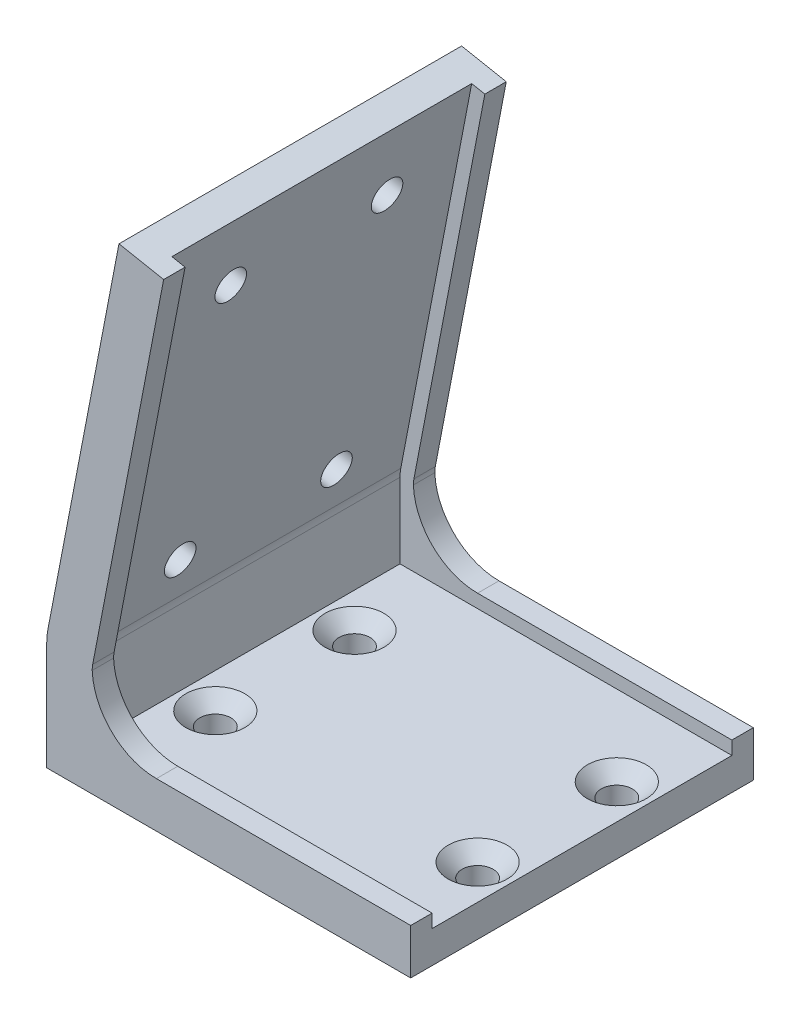
ISO-10303-21;
HEADER;
FILE_DESCRIPTION(('STEP AP214'),'2;1');
FILE_NAME('part.step','',(''),(''),'','','');
FILE_SCHEMA(('AUTOMOTIVE_DESIGN { 1 0 10303 214 1 1 1 1 }'));
ENDSEC;
DATA;
#1=APPLICATION_CONTEXT('core data for automotive mechanical design processes');
#2=APPLICATION_PROTOCOL_DEFINITION('international standard','automotive_design',2000,#1);
#3=PRODUCT_CONTEXT('',#1,'mechanical');
#4=PRODUCT('Part','Part','',(#3));
#5=PRODUCT_RELATED_PRODUCT_CATEGORY('part','',(#4));
#6=PRODUCT_DEFINITION_FORMATION('','',#4);
#7=PRODUCT_DEFINITION_CONTEXT('part definition',#1,'design');
#8=PRODUCT_DEFINITION('design','',#6,#7);
#9=PRODUCT_DEFINITION_SHAPE('','',#8);
#10=(LENGTH_UNIT() NAMED_UNIT(*) SI_UNIT(.MILLI.,.METRE.));
#11=(NAMED_UNIT(*) PLANE_ANGLE_UNIT() SI_UNIT($,.RADIAN.));
#12=(NAMED_UNIT(*) SI_UNIT($,.STERADIAN.) SOLID_ANGLE_UNIT());
#13=UNCERTAINTY_MEASURE_WITH_UNIT(LENGTH_MEASURE(1.E-05),#10,'distance_accuracy_value','');
#14=(GEOMETRIC_REPRESENTATION_CONTEXT(3) GLOBAL_UNCERTAINTY_ASSIGNED_CONTEXT((#13)) GLOBAL_UNIT_ASSIGNED_CONTEXT((#10,
#11,#12)) REPRESENTATION_CONTEXT('',''));
#15=CARTESIAN_POINT('',(0.,0.,0.));
#16=DIRECTION('',(0.,0.,1.));
#17=DIRECTION('',(1.,0.,0.));
#18=AXIS2_PLACEMENT_3D('',#15,#16,#17);
#19=CARTESIAN_POINT('',(-19.865724044626,3.82142894715047,14.));
#20=DIRECTION('',(0.981996385637288,-0.188899705122331,0.));
#21=DIRECTION('',(0.188899705122331,0.981996385637288,0.));
#22=AXIS2_PLACEMENT_3D('',#19,#20,#21);
#23=PLANE('',#22);
#24=CARTESIAN_POINT('',(-12.9558745481218,39.7423279579274,-7.30000000000002));
#25=DIRECTION('',(-0.981996385637288,0.188899705122331,0.));
#26=DIRECTION('',(-0.188899705122331,-0.981996385637288,0.));
#27=AXIS2_PLACEMENT_3D('',#24,#25,#26);
#28=CIRCLE('',#27,1.44999999999999);
#29=CARTESIAN_POINT('',(-13.2297791205491,38.3184331987534,-7.30000000000002));
#30=VERTEX_POINT('',#29);
#31=EDGE_CURVE('E392',#30,#30,#28,.T.);
#32=ORIENTED_EDGE('',*,*,#31,.F.);
#33=EDGE_LOOP('',(#32));
#34=FACE_BOUND('',#33,.T.);
#35=CARTESIAN_POINT('',(-12.9558745481218,39.7423279579274,7.30000000000002));
#36=DIRECTION('',(-0.981996385637288,0.188899705122331,0.));
#37=DIRECTION('',(-0.188899705122331,-0.981996385637288,0.));
#38=AXIS2_PLACEMENT_3D('',#35,#36,#37);
#39=CIRCLE('',#38,1.44999999999999);
#40=CARTESIAN_POINT('',(-13.2297791205491,38.3184331987534,7.30000000000002));
#41=VERTEX_POINT('',#40);
#42=EDGE_CURVE('E637',#41,#41,#39,.T.);
#43=ORIENTED_EDGE('',*,*,#42,.F.);
#44=EDGE_LOOP('',(#43));
#45=FACE_BOUND('',#44,.T.);
#46=CARTESIAN_POINT('',(-17.67836717618,15.1924183169953,-7.30000000000002));
#47=DIRECTION('',(-0.981996385637288,0.188899705122331,0.));
#48=DIRECTION('',(-0.188899705122331,-0.981996385637288,0.));
#49=AXIS2_PLACEMENT_3D('',#46,#47,#48);
#50=CIRCLE('',#49,1.44999999999999);
#51=CARTESIAN_POINT('',(-17.9522717486074,13.7685235578212,-7.30000000000002));
#52=VERTEX_POINT('',#51);
#53=EDGE_CURVE('E645',#52,#52,#50,.T.);
#54=ORIENTED_EDGE('',*,*,#53,.F.);
#55=EDGE_LOOP('',(#54));
#56=FACE_BOUND('',#55,.T.);
#57=CARTESIAN_POINT('',(-17.67836717618,15.1924183169953,7.30000000000002));
#58=DIRECTION('',(-0.981996385637288,0.188899705122331,0.));
#59=DIRECTION('',(-0.188899705122331,-0.981996385637288,0.));
#60=AXIS2_PLACEMENT_3D('',#57,#58,#59);
#61=CIRCLE('',#60,1.44999999999999);
#62=CARTESIAN_POINT('',(-17.9522717486074,13.7685235578212,7.30000000000002));
#63=VERTEX_POINT('',#62);
#64=EDGE_CURVE('E653',#63,#63,#61,.T.);
#65=ORIENTED_EDGE('',*,*,#64,.F.);
#66=EDGE_LOOP('',(#65));
#67=FACE_BOUND('',#66,.T.);
#68=DIRECTION('',(0.,0.,-1.));
#69=VECTOR('',#68,1.);
#70=CARTESIAN_POINT('',(-11.7494191021825,46.0140946956126,14.));
#71=LINE('',#70,#69);
#72=CARTESIAN_POINT('',(-11.7494191021825,46.0140946956126,16.));
#73=VERTEX_POINT('',#72);
#74=CARTESIAN_POINT('',(-11.7494191021825,46.0140946956126,-16.));
#75=VERTEX_POINT('',#74);
#76=EDGE_CURVE('E358',#73,#75,#71,.T.);
#77=ORIENTED_EDGE('',*,*,#76,.T.);
#78=DIRECTION('',(-0.188899705122331,-0.981996385637288,0.));
#79=VECTOR('',#78,1.);
#80=CARTESIAN_POINT('',(-19.865724044626,3.82142894715047,-16.));
#81=LINE('',#80,#79);
#82=CARTESIAN_POINT('',(-18.373974699461,11.5762979358563,-16.));
#83=VERTEX_POINT('',#82);
#84=EDGE_CURVE('E224',#75,#83,#81,.T.);
#85=ORIENTED_EDGE('',*,*,#84,.T.);
#86=DIRECTION('',(0.,0.,-1.));
#87=VECTOR('',#86,1.);
#88=CARTESIAN_POINT('',(-18.373974699461,11.5762979358563,14.));
#89=LINE('',#88,#87);
#90=CARTESIAN_POINT('',(-18.373974699461,11.5762979358563,16.));
#91=VERTEX_POINT('',#90);
#92=EDGE_CURVE('E384',#91,#83,#89,.T.);
#93=ORIENTED_EDGE('',*,*,#92,.F.);
#94=DIRECTION('',(0.188899705122331,0.981996385637288,0.));
#95=VECTOR('',#94,1.);
#96=CARTESIAN_POINT('',(-19.865724044626,3.82142894715047,16.));
#97=LINE('',#96,#95);
#98=EDGE_CURVE('E286',#91,#73,#97,.T.);
#99=ORIENTED_EDGE('',*,*,#98,.T.);
#100=EDGE_LOOP('',(#77,#85,#93,#99));
#101=FACE_BOUND('',#100,.T.);
#102=ADVANCED_FACE('F41',(#34,#45,#56,#67,#101),#23,.F.);
#103=CARTESIAN_POINT('',(-11.5,10.254,14.));
#104=DIRECTION('',(0.,0.,-1.));
#105=DIRECTION('',(-1.,0.,0.));
#106=AXIS2_PLACEMENT_3D('',#103,#104,#105);
#107=CYLINDRICAL_SURFACE('',#106,7.);
#108=ORIENTED_EDGE('',*,*,#92,.T.);
#109=CARTESIAN_POINT('',(-11.5,10.254,-16.));
#110=DIRECTION('',(0.,0.,1.));
#111=DIRECTION('',(1.,0.,0.));
#112=AXIS2_PLACEMENT_3D('',#109,#110,#111);
#113=CIRCLE('',#112,7.);
#114=CARTESIAN_POINT('',(-18.5,10.254,-16.));
#115=VERTEX_POINT('',#114);
#116=EDGE_CURVE('E220',#83,#115,#113,.T.);
#117=ORIENTED_EDGE('',*,*,#116,.T.);
#118=DIRECTION('',(0.,0.,-1.));
#119=VECTOR('',#118,1.);
#120=CARTESIAN_POINT('',(-18.5,10.254,14.));
#121=LINE('',#120,#119);
#122=CARTESIAN_POINT('',(-18.5,10.254,16.));
#123=VERTEX_POINT('',#122);
#124=EDGE_CURVE('E381',#123,#115,#121,.T.);
#125=ORIENTED_EDGE('',*,*,#124,.F.);
#126=CARTESIAN_POINT('',(-11.5,10.254,16.));
#127=DIRECTION('',(0.,0.,1.));
#128=DIRECTION('',(1.,0.,0.));
#129=AXIS2_PLACEMENT_3D('',#126,#127,#128);
#130=CIRCLE('',#129,7.);
#131=EDGE_CURVE('E282',#91,#123,#130,.T.);
#132=ORIENTED_EDGE('',*,*,#131,.F.);
#133=EDGE_LOOP('',(#108,#117,#125,#132));
#134=FACE_BOUND('',#133,.T.);
#135=ADVANCED_FACE('F445',(#134),#107,.T.);
#136=CARTESIAN_POINT('',(-18.5,0.,14.));
#137=DIRECTION('',(1.,0.,0.));
#138=DIRECTION('',(0.,0.,-1.));
#139=AXIS2_PLACEMENT_3D('',#136,#137,#138);
#140=PLANE('',#139);
#141=ORIENTED_EDGE('',*,*,#124,.T.);
#142=DIRECTION('',(0.,-1.,0.));
#143=VECTOR('',#142,1.);
#144=CARTESIAN_POINT('',(-18.5,0.,-16.));
#145=LINE('',#144,#143);
#146=CARTESIAN_POINT('',(-18.5,0.250000000000004,-16.));
#147=VERTEX_POINT('',#146);
#148=EDGE_CURVE('E213',#115,#147,#145,.T.);
#149=ORIENTED_EDGE('',*,*,#148,.T.);
#150=DIRECTION('',(0.,0.,-1.));
#151=VECTOR('',#150,1.);
#152=CARTESIAN_POINT('',(-18.5,0.250000000000003,14.));
#153=LINE('',#152,#151);
#154=CARTESIAN_POINT('',(-18.5,0.250000000000003,16.));
#155=VERTEX_POINT('',#154);
#156=EDGE_CURVE('E378',#155,#147,#153,.T.);
#157=ORIENTED_EDGE('',*,*,#156,.F.);
#158=DIRECTION('',(0.,1.,0.));
#159=VECTOR('',#158,1.);
#160=CARTESIAN_POINT('',(-18.5,0.,16.));
#161=LINE('',#160,#159);
#162=EDGE_CURVE('E278',#155,#123,#161,.T.);
#163=ORIENTED_EDGE('',*,*,#162,.T.);
#164=EDGE_LOOP('',(#141,#149,#157,#163));
#165=FACE_BOUND('',#164,.T.);
#166=ADVANCED_FACE('F450',(#165),#140,.F.);
#167=CARTESIAN_POINT('',(0.,0.250000000000003,14.));
#168=DIRECTION('',(0.,1.,0.));
#169=DIRECTION('',(0.,0.,1.));
#170=AXIS2_PLACEMENT_3D('',#167,#168,#169);
#171=PLANE('',#170);
#172=CARTESIAN_POINT('',(-12.25,0.250000000000003,-6.5));
#173=DIRECTION('',(0.,1.,0.));
#174=DIRECTION('',(0.,0.,1.));
#175=AXIS2_PLACEMENT_3D('',#172,#173,#174);
#176=CIRCLE('',#175,1.45);
#177=CARTESIAN_POINT('',(-12.25,0.250000000000003,-5.05));
#178=VERTEX_POINT('',#177);
#179=EDGE_CURVE('E406',#178,#178,#176,.T.);
#180=ORIENTED_EDGE('',*,*,#179,.T.);
#181=EDGE_LOOP('',(#180));
#182=FACE_BOUND('',#181,.T.);
#183=CARTESIAN_POINT('',(12.25,0.250000000000003,-6.5));
#184=DIRECTION('',(0.,1.,0.));
#185=DIRECTION('',(0.,0.,1.));
#186=AXIS2_PLACEMENT_3D('',#183,#184,#185);
#187=CIRCLE('',#186,1.45);
#188=CARTESIAN_POINT('',(12.25,0.250000000000003,-5.05));
#189=VERTEX_POINT('',#188);
#190=EDGE_CURVE('E400',#189,#189,#187,.T.);
#191=ORIENTED_EDGE('',*,*,#190,.T.);
#192=EDGE_LOOP('',(#191));
#193=FACE_BOUND('',#192,.T.);
#194=CARTESIAN_POINT('',(12.25,0.250000000000003,6.5));
#195=DIRECTION('',(0.,1.,0.));
#196=DIRECTION('',(0.,0.,1.));
#197=AXIS2_PLACEMENT_3D('',#194,#195,#196);
#198=CIRCLE('',#197,1.45);
#199=CARTESIAN_POINT('',(12.25,0.250000000000003,7.95));
#200=VERTEX_POINT('',#199);
#201=EDGE_CURVE('E394',#200,#200,#198,.T.);
#202=ORIENTED_EDGE('',*,*,#201,.T.);
#203=EDGE_LOOP('',(#202));
#204=FACE_BOUND('',#203,.T.);
#205=CARTESIAN_POINT('',(-12.25,0.250000000000003,6.5));
#206=DIRECTION('',(0.,1.,0.));
#207=DIRECTION('',(0.,0.,1.));
#208=AXIS2_PLACEMENT_3D('',#205,#206,#207);
#209=CIRCLE('',#208,1.45);
#210=CARTESIAN_POINT('',(-12.25,0.250000000000003,7.95));
#211=VERTEX_POINT('',#210);
#212=EDGE_CURVE('E388',#211,#211,#209,.T.);
#213=ORIENTED_EDGE('',*,*,#212,.T.);
#214=EDGE_LOOP('',(#213));
#215=FACE_BOUND('',#214,.T.);
#216=ORIENTED_EDGE('',*,*,#156,.T.);
#217=DIRECTION('',(1.,0.,0.));
#218=VECTOR('',#217,1.);
#219=CARTESIAN_POINT('',(0.,0.250000000000003,-16.));
#220=LINE('',#219,#218);
#221=CARTESIAN_POINT('',(15.5,0.250000000000003,-16.));
#222=VERTEX_POINT('',#221);
#223=EDGE_CURVE('E210',#147,#222,#220,.T.);
#224=ORIENTED_EDGE('',*,*,#223,.T.);
#225=DIRECTION('',(0.,0.,-1.));
#226=VECTOR('',#225,1.);
#227=CARTESIAN_POINT('',(15.5,0.250000000000003,14.));
#228=LINE('',#227,#226);
#229=CARTESIAN_POINT('',(15.5,0.250000000000003,16.));
#230=VERTEX_POINT('',#229);
#231=EDGE_CURVE('E208',#230,#222,#228,.T.);
#232=ORIENTED_EDGE('',*,*,#231,.F.);
#233=DIRECTION('',(-1.,0.,0.));
#234=VECTOR('',#233,1.);
#235=CARTESIAN_POINT('',(0.,0.250000000000003,16.));
#236=LINE('',#235,#234);
#237=EDGE_CURVE('E274',#230,#155,#236,.T.);
#238=ORIENTED_EDGE('',*,*,#237,.T.);
#239=EDGE_LOOP('',(#216,#224,#232,#238));
#240=FACE_BOUND('',#239,.T.);
#241=ADVANCED_FACE('F458',(#182,#193,#204,#215,#240),#171,.F.);
#242=CARTESIAN_POINT('',(15.5,0.,14.));
#243=DIRECTION('',(1.,0.,0.));
#244=DIRECTION('',(0.,0.,-1.));
#245=AXIS2_PLACEMENT_3D('',#242,#243,#244);
#246=PLANE('',#245);
#247=ORIENTED_EDGE('',*,*,#231,.T.);
#248=DIRECTION('',(0.,-1.,0.));
#249=VECTOR('',#248,1.);
#250=CARTESIAN_POINT('',(15.5,0.,-16.));
#251=LINE('',#250,#249);
#252=CARTESIAN_POINT('',(15.5,4.5,-16.));
#253=VERTEX_POINT('',#252);
#254=EDGE_CURVE('E184',#253,#222,#251,.T.);
#255=ORIENTED_EDGE('',*,*,#254,.F.);
#256=DIRECTION('',(0.,0.,1.));
#257=VECTOR('',#256,1.);
#258=CARTESIAN_POINT('',(15.5,4.5,-16.));
#259=LINE('',#258,#257);
#260=CARTESIAN_POINT('',(15.5,4.5,-14.));
#261=VERTEX_POINT('',#260);
#262=EDGE_CURVE('E195',#253,#261,#259,.T.);
#263=ORIENTED_EDGE('',*,*,#262,.T.);
#264=DIRECTION('',(0.,-1.,0.));
#265=VECTOR('',#264,1.);
#266=CARTESIAN_POINT('',(15.5,0.,-14.));
#267=LINE('',#266,#265);
#268=CARTESIAN_POINT('',(15.5,3.25,-14.));
#269=VERTEX_POINT('',#268);
#270=EDGE_CURVE('E240',#261,#269,#267,.T.);
#271=ORIENTED_EDGE('',*,*,#270,.T.);
#272=DIRECTION('',(0.,0.,-1.));
#273=VECTOR('',#272,1.);
#274=CARTESIAN_POINT('',(15.5,3.25,14.));
#275=LINE('',#274,#273);
#276=CARTESIAN_POINT('',(15.5,3.25,14.));
#277=VERTEX_POINT('',#276);
#278=EDGE_CURVE('E373',#277,#269,#275,.T.);
#279=ORIENTED_EDGE('',*,*,#278,.F.);
#280=DIRECTION('',(0.,1.,0.));
#281=VECTOR('',#280,1.);
#282=CARTESIAN_POINT('',(15.5,0.,14.));
#283=LINE('',#282,#281);
#284=CARTESIAN_POINT('',(15.5,4.5,14.));
#285=VERTEX_POINT('',#284);
#286=EDGE_CURVE('E303',#277,#285,#283,.T.);
#287=ORIENTED_EDGE('',*,*,#286,.T.);
#288=DIRECTION('',(0.,0.,-1.));
#289=VECTOR('',#288,1.);
#290=CARTESIAN_POINT('',(15.5,4.5,16.));
#291=LINE('',#290,#289);
#292=CARTESIAN_POINT('',(15.5,4.5,16.));
#293=VERTEX_POINT('',#292);
#294=EDGE_CURVE('E320',#293,#285,#291,.T.);
#295=ORIENTED_EDGE('',*,*,#294,.F.);
#296=DIRECTION('',(0.,1.,0.));
#297=VECTOR('',#296,1.);
#298=CARTESIAN_POINT('',(15.5,0.,16.));
#299=LINE('',#298,#297);
#300=EDGE_CURVE('E271',#230,#293,#299,.T.);
#301=ORIENTED_EDGE('',*,*,#300,.F.);
#302=EDGE_LOOP('',(#247,#255,#263,#271,#279,#287,#295,#301));
#303=FACE_BOUND('',#302,.T.);
#304=ADVANCED_FACE('F206',(#303),#246,.T.);
#305=CARTESIAN_POINT('',(0.,3.25,14.));
#306=DIRECTION('',(0.,1.,0.));
#307=DIRECTION('',(0.,0.,1.));
#308=AXIS2_PLACEMENT_3D('',#305,#306,#307);
#309=PLANE('',#308);
#310=CARTESIAN_POINT('',(-12.25,3.25,-6.5));
#311=DIRECTION('',(0.,1.,0.));
#312=DIRECTION('',(0.,0.,1.));
#313=AXIS2_PLACEMENT_3D('',#310,#311,#312);
#314=CIRCLE('',#313,2.75);
#315=CARTESIAN_POINT('',(-12.25,3.25,-3.75));
#316=VERTEX_POINT('',#315);
#317=EDGE_CURVE('E606',#316,#316,#314,.T.);
#318=ORIENTED_EDGE('',*,*,#317,.F.);
#319=EDGE_LOOP('',(#318));
#320=FACE_BOUND('',#319,.T.);
#321=CARTESIAN_POINT('',(12.25,3.25,-6.5));
#322=DIRECTION('',(0.,1.,0.));
#323=DIRECTION('',(0.,0.,1.));
#324=AXIS2_PLACEMENT_3D('',#321,#322,#323);
#325=CIRCLE('',#324,2.75);
#326=CARTESIAN_POINT('',(12.25,3.25,-3.75));
#327=VERTEX_POINT('',#326);
#328=EDGE_CURVE('E410',#327,#327,#325,.T.);
#329=ORIENTED_EDGE('',*,*,#328,.F.);
#330=EDGE_LOOP('',(#329));
#331=FACE_BOUND('',#330,.T.);
#332=CARTESIAN_POINT('',(12.25,3.25,6.5));
#333=DIRECTION('',(0.,1.,0.));
#334=DIRECTION('',(0.,0.,1.));
#335=AXIS2_PLACEMENT_3D('',#332,#333,#334);
#336=CIRCLE('',#335,2.75);
#337=CARTESIAN_POINT('',(12.25,3.25,9.25));
#338=VERTEX_POINT('',#337);
#339=EDGE_CURVE('E404',#338,#338,#336,.T.);
#340=ORIENTED_EDGE('',*,*,#339,.F.);
#341=EDGE_LOOP('',(#340));
#342=FACE_BOUND('',#341,.T.);
#343=CARTESIAN_POINT('',(-12.25,3.25,6.5));
#344=DIRECTION('',(0.,1.,0.));
#345=DIRECTION('',(0.,0.,1.));
#346=AXIS2_PLACEMENT_3D('',#343,#344,#345);
#347=CIRCLE('',#346,2.75);
#348=CARTESIAN_POINT('',(-12.25,3.25,9.25));
#349=VERTEX_POINT('',#348);
#350=EDGE_CURVE('E398',#349,#349,#347,.T.);
#351=ORIENTED_EDGE('',*,*,#350,.F.);
#352=EDGE_LOOP('',(#351));
#353=FACE_BOUND('',#352,.T.);
#354=ORIENTED_EDGE('',*,*,#278,.T.);
#355=DIRECTION('',(1.,0.,0.));
#356=VECTOR('',#355,1.);
#357=CARTESIAN_POINT('',(0.,3.25,-14.));
#358=LINE('',#357,#356);
#359=CARTESIAN_POINT('',(-15.5,3.25,-14.));
#360=VERTEX_POINT('',#359);
#361=EDGE_CURVE('E315',#360,#269,#358,.T.);
#362=ORIENTED_EDGE('',*,*,#361,.F.);
#363=DIRECTION('',(0.,0.,-1.));
#364=VECTOR('',#363,1.);
#365=CARTESIAN_POINT('',(-15.5,3.25,14.));
#366=LINE('',#365,#364);
#367=CARTESIAN_POINT('',(-15.5,3.25,14.));
#368=VERTEX_POINT('',#367);
#369=EDGE_CURVE('E370',#368,#360,#366,.T.);
#370=ORIENTED_EDGE('',*,*,#369,.F.);
#371=DIRECTION('',(1.,0.,0.));
#372=VECTOR('',#371,1.);
#373=CARTESIAN_POINT('',(0.,3.25,14.));
#374=LINE('',#373,#372);
#375=EDGE_CURVE('E342',#368,#277,#374,.T.);
#376=ORIENTED_EDGE('',*,*,#375,.T.);
#377=EDGE_LOOP('',(#354,#362,#370,#376));
#378=FACE_BOUND('',#377,.T.);
#379=ADVANCED_FACE('F465',(#320,#331,#342,#353,#378),#309,.T.);
#380=CARTESIAN_POINT('',(-15.5,0.,14.));
#381=DIRECTION('',(1.,0.,0.));
#382=DIRECTION('',(0.,0.,-1.));
#383=AXIS2_PLACEMENT_3D('',#380,#381,#382);
#384=PLANE('',#383);
#385=ORIENTED_EDGE('',*,*,#369,.T.);
#386=DIRECTION('',(0.,-1.,0.));
#387=VECTOR('',#386,1.);
#388=CARTESIAN_POINT('',(-15.5,0.,-14.));
#389=LINE('',#388,#387);
#390=CARTESIAN_POINT('',(-15.5,10.254,-14.));
#391=VERTEX_POINT('',#390);
#392=EDGE_CURVE('E330',#391,#360,#389,.T.);
#393=ORIENTED_EDGE('',*,*,#392,.F.);
#394=DIRECTION('',(0.,0.,-1.));
#395=VECTOR('',#394,1.);
#396=CARTESIAN_POINT('',(-15.5,10.254,14.));
#397=LINE('',#396,#395);
#398=CARTESIAN_POINT('',(-15.5,10.254,14.));
#399=VERTEX_POINT('',#398);
#400=EDGE_CURVE('E367',#399,#391,#397,.T.);
#401=ORIENTED_EDGE('',*,*,#400,.F.);
#402=DIRECTION('',(0.,-1.,0.));
#403=VECTOR('',#402,1.);
#404=CARTESIAN_POINT('',(-15.5,0.,14.));
#405=LINE('',#404,#403);
#406=EDGE_CURVE('E346',#399,#368,#405,.T.);
#407=ORIENTED_EDGE('',*,*,#406,.T.);
#408=EDGE_LOOP('',(#385,#393,#401,#407));
#409=FACE_BOUND('',#408,.T.);
#410=ADVANCED_FACE('F468',(#409),#384,.T.);
#411=CARTESIAN_POINT('',(-11.5,10.254,14.));
#412=DIRECTION('',(0.,0.,-1.));
#413=DIRECTION('',(-1.,0.,0.));
#414=AXIS2_PLACEMENT_3D('',#411,#412,#413);
#415=CYLINDRICAL_SURFACE('',#414,4.);
#416=ORIENTED_EDGE('',*,*,#400,.T.);
#417=CARTESIAN_POINT('',(-11.5,10.254,-14.));
#418=DIRECTION('',(0.,0.,1.));
#419=DIRECTION('',(1.,0.,0.));
#420=AXIS2_PLACEMENT_3D('',#417,#418,#419);
#421=CIRCLE('',#420,4.);
#422=CARTESIAN_POINT('',(-15.4279855425491,11.0095988204893,-14.));
#423=VERTEX_POINT('',#422);
#424=EDGE_CURVE('E334',#423,#391,#421,.T.);
#425=ORIENTED_EDGE('',*,*,#424,.F.);
#426=DIRECTION('',(0.,0.,-1.));
#427=VECTOR('',#426,1.);
#428=CARTESIAN_POINT('',(-15.4279855425491,11.0095988204893,14.));
#429=LINE('',#428,#427);
#430=CARTESIAN_POINT('',(-15.4279855425491,11.0095988204893,14.));
#431=VERTEX_POINT('',#430);
#432=EDGE_CURVE('E364',#431,#423,#429,.T.);
#433=ORIENTED_EDGE('',*,*,#432,.F.);
#434=CARTESIAN_POINT('',(-11.5,10.254,14.));
#435=DIRECTION('',(0.,0.,1.));
#436=DIRECTION('',(1.,0.,0.));
#437=AXIS2_PLACEMENT_3D('',#434,#435,#436);
#438=CIRCLE('',#437,4.);
#439=EDGE_CURVE('E350',#431,#399,#438,.T.);
#440=ORIENTED_EDGE('',*,*,#439,.T.);
#441=EDGE_LOOP('',(#416,#425,#433,#440));
#442=FACE_BOUND('',#441,.T.);
#443=ADVANCED_FACE('F472',(#442),#415,.F.);
#444=CARTESIAN_POINT('',(-16.9197348877142,3.25472983178348,14.));
#445=DIRECTION('',(0.981996385637288,-0.188899705122331,0.));
#446=DIRECTION('',(0.188899705122331,0.981996385637288,0.));
#447=AXIS2_PLACEMENT_3D('',#444,#445,#446);
#448=PLANE('',#447);
#449=CARTESIAN_POINT('',(-10.0098853912099,39.1756288425605,-7.30000000000002));
#450=DIRECTION('',(0.981996385637288,-0.188899705122331,0.));
#451=DIRECTION('',(0.188899705122331,0.981996385637288,0.));
#452=AXIS2_PLACEMENT_3D('',#449,#450,#451);
#453=CIRCLE('',#452,1.44999999999999);
#454=CARTESIAN_POINT('',(-9.73598081878253,40.5995236017345,-7.30000000000002));
#455=VERTEX_POINT('',#454);
#456=EDGE_CURVE('E633',#455,#455,#453,.T.);
#457=ORIENTED_EDGE('',*,*,#456,.F.);
#458=EDGE_LOOP('',(#457));
#459=FACE_BOUND('',#458,.T.);
#460=CARTESIAN_POINT('',(-10.0098853912099,39.1756288425605,7.30000000000002));
#461=DIRECTION('',(0.981996385637288,-0.188899705122331,0.));
#462=DIRECTION('',(0.188899705122331,0.981996385637288,0.));
#463=AXIS2_PLACEMENT_3D('',#460,#461,#462);
#464=CIRCLE('',#463,1.44999999999999);
#465=CARTESIAN_POINT('',(-9.73598081878253,40.5995236017345,7.30000000000002));
#466=VERTEX_POINT('',#465);
#467=EDGE_CURVE('E641',#466,#466,#464,.T.);
#468=ORIENTED_EDGE('',*,*,#467,.F.);
#469=EDGE_LOOP('',(#468));
#470=FACE_BOUND('',#469,.T.);
#471=CARTESIAN_POINT('',(-14.7323780192682,14.6257192016283,-7.30000000000002));
#472=DIRECTION('',(0.981996385637288,-0.188899705122331,0.));
#473=DIRECTION('',(0.188899705122331,0.981996385637288,0.));
#474=AXIS2_PLACEMENT_3D('',#471,#472,#473);
#475=CIRCLE('',#474,1.44999999999999);
#476=CARTESIAN_POINT('',(-14.4584734468408,16.0496139608023,-7.30000000000002));
#477=VERTEX_POINT('',#476);
#478=EDGE_CURVE('E649',#477,#477,#475,.T.);
#479=ORIENTED_EDGE('',*,*,#478,.F.);
#480=EDGE_LOOP('',(#479));
#481=FACE_BOUND('',#480,.T.);
#482=CARTESIAN_POINT('',(-14.7323780192682,14.6257192016283,7.30000000000002));
#483=DIRECTION('',(0.981996385637288,-0.188899705122331,0.));
#484=DIRECTION('',(0.188899705122331,0.981996385637288,0.));
#485=AXIS2_PLACEMENT_3D('',#482,#483,#484);
#486=CIRCLE('',#485,1.44999999999999);
#487=CARTESIAN_POINT('',(-14.4584734468408,16.0496139608023,7.30000000000002));
#488=VERTEX_POINT('',#487);
#489=EDGE_CURVE('E241',#488,#488,#486,.T.);
#490=ORIENTED_EDGE('',*,*,#489,.F.);
#491=EDGE_LOOP('',(#490));
#492=FACE_BOUND('',#491,.T.);
#493=ORIENTED_EDGE('',*,*,#432,.T.);
#494=DIRECTION('',(-0.188899705122331,-0.981996385637288,0.));
#495=VECTOR('',#494,1.);
#496=CARTESIAN_POINT('',(-16.9197348877142,3.25472983178348,-14.));
#497=LINE('',#496,#495);
#498=CARTESIAN_POINT('',(-8.80342994527065,45.4473955802456,-14.));
#499=VERTEX_POINT('',#498);
#500=EDGE_CURVE('E338',#499,#423,#497,.T.);
#501=ORIENTED_EDGE('',*,*,#500,.F.);
#502=DIRECTION('',(0.,0.,-1.));
#503=VECTOR('',#502,1.);
#504=CARTESIAN_POINT('',(-8.80342994527065,45.4473955802456,14.));
#505=LINE('',#504,#503);
#506=CARTESIAN_POINT('',(-8.80342994527065,45.4473955802456,14.));
#507=VERTEX_POINT('',#506);
#508=EDGE_CURVE('E361',#507,#499,#505,.T.);
#509=ORIENTED_EDGE('',*,*,#508,.F.);
#510=DIRECTION('',(-0.188899705122331,-0.981996385637288,0.));
#511=VECTOR('',#510,1.);
#512=CARTESIAN_POINT('',(-16.9197348877142,3.25472983178348,14.));
#513=LINE('',#512,#511);
#514=EDGE_CURVE('E354',#507,#431,#513,.T.);
#515=ORIENTED_EDGE('',*,*,#514,.T.);
#516=EDGE_LOOP('',(#493,#501,#509,#515));
#517=FACE_BOUND('',#516,.T.);
#518=ADVANCED_FACE('F476',(#459,#470,#481,#492,#517),#448,.T.);
#519=CARTESIAN_POINT('',(8.11630494244354,42.1926657484621,14.));
#520=DIRECTION('',(0.188899705122332,0.981996385637287,0.));
#521=DIRECTION('',(-0.981996385637288,0.188899705122332,0.));
#522=AXIS2_PLACEMENT_3D('',#519,#520,#521);
#523=PLANE('',#522);
#524=ORIENTED_EDGE('',*,*,#508,.T.);
#525=DIRECTION('',(0.981996385637288,-0.188899705122332,0.));
#526=VECTOR('',#525,1.);
#527=CARTESIAN_POINT('',(8.11630494244354,42.1926657484621,-14.));
#528=LINE('',#527,#526);
#529=CARTESIAN_POINT('',(-7.57593446322404,45.2112709488427,-14.));
#530=VERTEX_POINT('',#529);
#531=EDGE_CURVE('E244',#499,#530,#528,.T.);
#532=ORIENTED_EDGE('',*,*,#531,.T.);
#533=DIRECTION('',(0.,0.,1.));
#534=VECTOR('',#533,1.);
#535=CARTESIAN_POINT('',(-7.57593446322404,45.2112709488427,-16.));
#536=LINE('',#535,#534);
#537=CARTESIAN_POINT('',(-7.57593446322404,45.2112709488427,-16.));
#538=VERTEX_POINT('',#537);
#539=EDGE_CURVE('E204',#538,#530,#536,.T.);
#540=ORIENTED_EDGE('',*,*,#539,.F.);
#541=DIRECTION('',(0.981996385637288,-0.188899705122332,0.));
#542=VECTOR('',#541,1.);
#543=CARTESIAN_POINT('',(8.11630494244354,42.1926657484621,-16.));
#544=LINE('',#543,#542);
#545=EDGE_CURVE('E228',#75,#538,#544,.T.);
#546=ORIENTED_EDGE('',*,*,#545,.F.);
#547=ORIENTED_EDGE('',*,*,#76,.F.);
#548=DIRECTION('',(-0.981996385637288,0.188899705122332,0.));
#549=VECTOR('',#548,1.);
#550=CARTESIAN_POINT('',(8.11630494244354,42.1926657484621,16.));
#551=LINE('',#550,#549);
#552=CARTESIAN_POINT('',(-7.57593446322404,45.2112709488427,16.));
#553=VERTEX_POINT('',#552);
#554=EDGE_CURVE('E290',#553,#73,#551,.T.);
#555=ORIENTED_EDGE('',*,*,#554,.F.);
#556=DIRECTION('',(0.,0.,-1.));
#557=VECTOR('',#556,1.);
#558=CARTESIAN_POINT('',(-7.57593446322404,45.2112709488427,16.));
#559=LINE('',#558,#557);
#560=CARTESIAN_POINT('',(-7.57593446322404,45.2112709488427,14.));
#561=VERTEX_POINT('',#560);
#562=EDGE_CURVE('E316',#553,#561,#559,.T.);
#563=ORIENTED_EDGE('',*,*,#562,.T.);
#564=DIRECTION('',(-0.981996385637288,0.188899705122332,0.));
#565=VECTOR('',#564,1.);
#566=CARTESIAN_POINT('',(8.11630494244354,42.1926657484621,14.));
#567=LINE('',#566,#565);
#568=EDGE_CURVE('E306',#561,#507,#567,.T.);
#569=ORIENTED_EDGE('',*,*,#568,.T.);
#570=EDGE_LOOP('',(#524,#532,#540,#546,#547,#555,#563,#569));
#571=FACE_BOUND('',#570,.T.);
#572=ADVANCED_FACE('F480',(#571),#523,.T.);
#573=CARTESIAN_POINT('',(-11.5,10.254,16.));
#574=DIRECTION('',(0.,0.,-1.));
#575=DIRECTION('',(-1.,0.,0.));
#576=AXIS2_PLACEMENT_3D('',#573,#574,#575);
#577=CYLINDRICAL_SURFACE('',#576,2.75);
#578=CARTESIAN_POINT('',(-11.5,10.254,14.));
#579=DIRECTION('',(0.,0.,1.));
#580=DIRECTION('',(1.,0.,0.));
#581=AXIS2_PLACEMENT_3D('',#578,#579,#580);
#582=CIRCLE('',#581,2.75);
#583=CARTESIAN_POINT('',(-14.2004900605025,10.7734741890864,14.));
#584=VERTEX_POINT('',#583);
#585=CARTESIAN_POINT('',(-14.25,10.254,14.));
#586=VERTEX_POINT('',#585);
#587=EDGE_CURVE('E203',#584,#586,#582,.T.);
#588=ORIENTED_EDGE('',*,*,#587,.F.);
#589=DIRECTION('',(0.,0.,-1.));
#590=VECTOR('',#589,1.);
#591=CARTESIAN_POINT('',(-14.2004900605025,10.7734741890864,16.));
#592=LINE('',#591,#590);
#593=CARTESIAN_POINT('',(-14.2004900605025,10.7734741890864,16.));
#594=VERTEX_POINT('',#593);
#595=EDGE_CURVE('E312',#594,#584,#592,.T.);
#596=ORIENTED_EDGE('',*,*,#595,.F.);
#597=CARTESIAN_POINT('',(-11.5,10.254,16.));
#598=DIRECTION('',(0.,0.,1.));
#599=DIRECTION('',(1.,0.,0.));
#600=AXIS2_PLACEMENT_3D('',#597,#598,#599);
#601=CIRCLE('',#600,2.75);
#602=CARTESIAN_POINT('',(-14.25,10.254,16.));
#603=VERTEX_POINT('',#602);
#604=EDGE_CURVE('E263',#594,#603,#601,.T.);
#605=ORIENTED_EDGE('',*,*,#604,.T.);
#606=DIRECTION('',(0.,0.,-1.));
#607=VECTOR('',#606,1.);
#608=CARTESIAN_POINT('',(-14.25,10.254,16.));
#609=LINE('',#608,#607);
#610=EDGE_CURVE('E297',#603,#586,#609,.T.);
#611=ORIENTED_EDGE('',*,*,#610,.T.);
#612=EDGE_LOOP('',(#588,#596,#605,#611));
#613=FACE_BOUND('',#612,.T.);
#614=ADVANCED_FACE('F484',(#613),#577,.F.);
#615=CARTESIAN_POINT('',(-15.6922394056676,3.01860520038056,16.));
#616=DIRECTION('',(-0.981996385637287,0.188899705122331,0.));
#617=DIRECTION('',(-0.188899705122331,-0.981996385637288,0.));
#618=AXIS2_PLACEMENT_3D('',#615,#616,#617);
#619=PLANE('',#618);
#620=DIRECTION('',(0.188899705122331,0.981996385637288,0.));
#621=VECTOR('',#620,1.);
#622=CARTESIAN_POINT('',(-15.6922394056676,3.01860520038056,14.));
#623=LINE('',#622,#621);
#624=EDGE_CURVE('E268',#584,#561,#623,.T.);
#625=ORIENTED_EDGE('',*,*,#624,.T.);
#626=ORIENTED_EDGE('',*,*,#562,.F.);
#627=DIRECTION('',(0.188899705122331,0.981996385637288,0.));
#628=VECTOR('',#627,1.);
#629=CARTESIAN_POINT('',(-15.6922394056676,3.01860520038056,16.));
#630=LINE('',#629,#628);
#631=EDGE_CURVE('E294',#594,#553,#630,.T.);
#632=ORIENTED_EDGE('',*,*,#631,.F.);
#633=ORIENTED_EDGE('',*,*,#595,.T.);
#634=EDGE_LOOP('',(#625,#626,#632,#633));
#635=FACE_BOUND('',#634,.T.);
#636=ADVANCED_FACE('F488',(#635),#619,.F.);
#637=CARTESIAN_POINT('',(0.,4.5,16.));
#638=DIRECTION('',(0.,-1.,0.));
#639=DIRECTION('',(0.,0.,-1.));
#640=AXIS2_PLACEMENT_3D('',#637,#638,#639);
#641=PLANE('',#640);
#642=DIRECTION('',(-1.,0.,0.));
#643=VECTOR('',#642,1.);
#644=CARTESIAN_POINT('',(0.,4.5,14.));
#645=LINE('',#644,#643);
#646=CARTESIAN_POINT('',(-8.25504512110391,4.5,14.));
#647=VERTEX_POINT('',#646);
#648=EDGE_CURVE('E300',#285,#647,#645,.T.);
#649=ORIENTED_EDGE('',*,*,#648,.T.);
#650=DIRECTION('',(0.,0.,-1.));
#651=VECTOR('',#650,1.);
#652=CARTESIAN_POINT('',(-8.25504512110391,4.5,16.));
#653=LINE('',#652,#651);
#654=CARTESIAN_POINT('',(-8.25504512110391,4.5,16.));
#655=VERTEX_POINT('',#654);
#656=EDGE_CURVE('E57',#647,#655,#653,.F.);
#657=ORIENTED_EDGE('',*,*,#656,.T.);
#658=DIRECTION('',(-1.,0.,0.));
#659=VECTOR('',#658,1.);
#660=CARTESIAN_POINT('',(0.,4.5,16.));
#661=LINE('',#660,#659);
#662=EDGE_CURVE('E267',#293,#655,#661,.T.);
#663=ORIENTED_EDGE('',*,*,#662,.F.);
#664=ORIENTED_EDGE('',*,*,#294,.T.);
#665=EDGE_LOOP('',(#649,#657,#663,#664));
#666=FACE_BOUND('',#665,.T.);
#667=ADVANCED_FACE('F490',(#666),#641,.F.);
#668=CARTESIAN_POINT('',(-11.5,10.254,16.));
#669=DIRECTION('',(0.,0.,1.));
#670=DIRECTION('',(1.,0.,0.));
#671=AXIS2_PLACEMENT_3D('',#668,#669,#670);
#672=PLANE('',#671);
#673=ORIENTED_EDGE('',*,*,#604,.F.);
#674=ORIENTED_EDGE('',*,*,#631,.T.);
#675=ORIENTED_EDGE('',*,*,#554,.T.);
#676=ORIENTED_EDGE('',*,*,#98,.F.);
#677=ORIENTED_EDGE('',*,*,#131,.T.);
#678=ORIENTED_EDGE('',*,*,#162,.F.);
#679=ORIENTED_EDGE('',*,*,#237,.F.);
#680=ORIENTED_EDGE('',*,*,#300,.T.);
#681=ORIENTED_EDGE('',*,*,#662,.T.);
#682=CARTESIAN_POINT('',(-8.25504512110391,10.5,16.));
#683=DIRECTION('',(0.,0.,1.));
#684=DIRECTION('',(1.,0.,0.));
#685=AXIS2_PLACEMENT_3D('',#682,#683,#684);
#686=CIRCLE('',#685,6.);
#687=EDGE_CURVE('E11',#655,#603,#686,.F.);
#688=ORIENTED_EDGE('',*,*,#687,.T.);
#689=EDGE_LOOP('',(#673,#674,#675,#676,#677,#678,#679,#680,#681,#688));
#690=FACE_BOUND('',#689,.T.);
#691=ADVANCED_FACE('F493',(#690),#672,.T.);
#692=CARTESIAN_POINT('',(-11.5,10.254,14.));
#693=DIRECTION('',(0.,0.,1.));
#694=DIRECTION('',(1.,0.,0.));
#695=AXIS2_PLACEMENT_3D('',#692,#693,#694);
#696=PLANE('',#695);
#697=ORIENTED_EDGE('',*,*,#375,.F.);
#698=ORIENTED_EDGE('',*,*,#406,.F.);
#699=ORIENTED_EDGE('',*,*,#439,.F.);
#700=ORIENTED_EDGE('',*,*,#514,.F.);
#701=ORIENTED_EDGE('',*,*,#568,.F.);
#702=ORIENTED_EDGE('',*,*,#624,.F.);
#703=ORIENTED_EDGE('',*,*,#587,.T.);
#704=CARTESIAN_POINT('',(-8.25504512110391,10.5,14.));
#705=DIRECTION('',(0.,0.,1.));
#706=DIRECTION('',(1.,0.,0.));
#707=AXIS2_PLACEMENT_3D('',#704,#705,#706);
#708=CIRCLE('',#707,6.);
#709=EDGE_CURVE('E50',#586,#647,#708,.T.);
#710=ORIENTED_EDGE('',*,*,#709,.T.);
#711=ORIENTED_EDGE('',*,*,#648,.F.);
#712=ORIENTED_EDGE('',*,*,#286,.F.);
#713=EDGE_LOOP('',(#697,#698,#699,#700,#701,#702,#703,#710,#711,#712));
#714=FACE_BOUND('',#713,.T.);
#715=ADVANCED_FACE('F497',(#714),#696,.F.);
#716=CARTESIAN_POINT('',(0.,4.5,-16.));
#717=DIRECTION('',(0.,-1.,0.));
#718=DIRECTION('',(0.,0.,-1.));
#719=AXIS2_PLACEMENT_3D('',#716,#717,#718);
#720=PLANE('',#719);
#721=DIRECTION('',(1.,0.,0.));
#722=VECTOR('',#721,1.);
#723=CARTESIAN_POINT('',(0.,4.5,-16.));
#724=LINE('',#723,#722);
#725=CARTESIAN_POINT('',(-8.25504512110391,4.5,-16.));
#726=VERTEX_POINT('',#725);
#727=EDGE_CURVE('E179',#726,#253,#724,.T.);
#728=ORIENTED_EDGE('',*,*,#727,.F.);
#729=DIRECTION('',(0.,0.,1.));
#730=VECTOR('',#729,1.);
#731=CARTESIAN_POINT('',(-8.25504512110391,4.5,-16.));
#732=LINE('',#731,#730);
#733=CARTESIAN_POINT('',(-8.25504512110391,4.5,-14.));
#734=VERTEX_POINT('',#733);
#735=EDGE_CURVE('E387',#726,#734,#732,.T.);
#736=ORIENTED_EDGE('',*,*,#735,.T.);
#737=DIRECTION('',(1.,0.,0.));
#738=VECTOR('',#737,1.);
#739=CARTESIAN_POINT('',(0.,4.5,-14.));
#740=LINE('',#739,#738);
#741=EDGE_CURVE('E198',#734,#261,#740,.T.);
#742=ORIENTED_EDGE('',*,*,#741,.T.);
#743=ORIENTED_EDGE('',*,*,#262,.F.);
#744=EDGE_LOOP('',(#728,#736,#742,#743));
#745=FACE_BOUND('',#744,.T.);
#746=ADVANCED_FACE('F196',(#745),#720,.F.);
#747=CARTESIAN_POINT('',(-15.6922394056676,3.01860520038056,-16.));
#748=DIRECTION('',(-0.981996385637287,0.188899705122331,0.));
#749=DIRECTION('',(-0.188899705122331,-0.981996385637288,0.));
#750=AXIS2_PLACEMENT_3D('',#747,#748,#749);
#751=PLANE('',#750);
#752=DIRECTION('',(-0.188899705122331,-0.981996385637288,0.));
#753=VECTOR('',#752,1.);
#754=CARTESIAN_POINT('',(-15.6922394056676,3.01860520038056,-14.));
#755=LINE('',#754,#753);
#756=CARTESIAN_POINT('',(-14.2004900605025,10.7734741890864,-14.));
#757=VERTEX_POINT('',#756);
#758=EDGE_CURVE('E247',#530,#757,#755,.T.);
#759=ORIENTED_EDGE('',*,*,#758,.T.);
#760=DIRECTION('',(0.,0.,1.));
#761=VECTOR('',#760,1.);
#762=CARTESIAN_POINT('',(-14.2004900605025,10.7734741890864,-16.));
#763=LINE('',#762,#761);
#764=CARTESIAN_POINT('',(-14.2004900605025,10.7734741890864,-16.));
#765=VERTEX_POINT('',#764);
#766=EDGE_CURVE('E256',#765,#757,#763,.T.);
#767=ORIENTED_EDGE('',*,*,#766,.F.);
#768=DIRECTION('',(-0.188899705122331,-0.981996385637288,0.));
#769=VECTOR('',#768,1.);
#770=CARTESIAN_POINT('',(-15.6922394056676,3.01860520038056,-16.));
#771=LINE('',#770,#769);
#772=EDGE_CURVE('E231',#538,#765,#771,.T.);
#773=ORIENTED_EDGE('',*,*,#772,.F.);
#774=ORIENTED_EDGE('',*,*,#539,.T.);
#775=EDGE_LOOP('',(#759,#767,#773,#774));
#776=FACE_BOUND('',#775,.T.);
#777=ADVANCED_FACE('F505',(#776),#751,.F.);
#778=CARTESIAN_POINT('',(-11.5,10.254,-16.));
#779=DIRECTION('',(0.,0.,1.));
#780=DIRECTION('',(1.,0.,0.));
#781=AXIS2_PLACEMENT_3D('',#778,#779,#780);
#782=CYLINDRICAL_SURFACE('',#781,2.75);
#783=CARTESIAN_POINT('',(-11.5,10.254,-14.));
#784=DIRECTION('',(0.,0.,1.));
#785=DIRECTION('',(1.,0.,0.));
#786=AXIS2_PLACEMENT_3D('',#783,#784,#785);
#787=CIRCLE('',#786,2.75);
#788=CARTESIAN_POINT('',(-14.25,10.254,-14.));
#789=VERTEX_POINT('',#788);
#790=EDGE_CURVE('E192',#757,#789,#787,.T.);
#791=ORIENTED_EDGE('',*,*,#790,.T.);
#792=DIRECTION('',(0.,0.,1.));
#793=VECTOR('',#792,1.);
#794=CARTESIAN_POINT('',(-14.25,10.254,-16.));
#795=LINE('',#794,#793);
#796=CARTESIAN_POINT('',(-14.25,10.254,-16.));
#797=VERTEX_POINT('',#796);
#798=EDGE_CURVE('E237',#797,#789,#795,.T.);
#799=ORIENTED_EDGE('',*,*,#798,.F.);
#800=CARTESIAN_POINT('',(-11.5,10.254,-16.));
#801=DIRECTION('',(0.,0.,1.));
#802=DIRECTION('',(1.,0.,0.));
#803=AXIS2_PLACEMENT_3D('',#800,#801,#802);
#804=CIRCLE('',#803,2.75);
#805=EDGE_CURVE('E234',#765,#797,#804,.T.);
#806=ORIENTED_EDGE('',*,*,#805,.F.);
#807=ORIENTED_EDGE('',*,*,#766,.T.);
#808=EDGE_LOOP('',(#791,#799,#806,#807));
#809=FACE_BOUND('',#808,.T.);
#810=ADVANCED_FACE('F429',(#809),#782,.F.);
#811=CARTESIAN_POINT('',(-11.5,10.254,-16.));
#812=DIRECTION('',(0.,0.,1.));
#813=DIRECTION('',(1.,0.,0.));
#814=AXIS2_PLACEMENT_3D('',#811,#812,#813);
#815=PLANE('',#814);
#816=ORIENTED_EDGE('',*,*,#805,.T.);
#817=CARTESIAN_POINT('',(-8.25504512110391,10.5,-16.));
#818=DIRECTION('',(0.,0.,1.));
#819=DIRECTION('',(1.,0.,0.));
#820=AXIS2_PLACEMENT_3D('',#817,#818,#819);
#821=CIRCLE('',#820,6.);
#822=EDGE_CURVE('E187',#797,#726,#821,.T.);
#823=ORIENTED_EDGE('',*,*,#822,.T.);
#824=ORIENTED_EDGE('',*,*,#727,.T.);
#825=ORIENTED_EDGE('',*,*,#254,.T.);
#826=ORIENTED_EDGE('',*,*,#223,.F.);
#827=ORIENTED_EDGE('',*,*,#148,.F.);
#828=ORIENTED_EDGE('',*,*,#116,.F.);
#829=ORIENTED_EDGE('',*,*,#84,.F.);
#830=ORIENTED_EDGE('',*,*,#545,.T.);
#831=ORIENTED_EDGE('',*,*,#772,.T.);
#832=EDGE_LOOP('',(#816,#823,#824,#825,#826,#827,#828,#829,#830,#831));
#833=FACE_BOUND('',#832,.T.);
#834=ADVANCED_FACE('F181',(#833),#815,.F.);
#835=CARTESIAN_POINT('',(-11.5,10.254,-14.));
#836=DIRECTION('',(0.,0.,1.));
#837=DIRECTION('',(1.,0.,0.));
#838=AXIS2_PLACEMENT_3D('',#835,#836,#837);
#839=PLANE('',#838);
#840=ORIENTED_EDGE('',*,*,#531,.F.);
#841=ORIENTED_EDGE('',*,*,#500,.T.);
#842=ORIENTED_EDGE('',*,*,#424,.T.);
#843=ORIENTED_EDGE('',*,*,#392,.T.);
#844=ORIENTED_EDGE('',*,*,#361,.T.);
#845=ORIENTED_EDGE('',*,*,#270,.F.);
#846=ORIENTED_EDGE('',*,*,#741,.F.);
#847=CARTESIAN_POINT('',(-8.25504512110391,10.5,-14.));
#848=DIRECTION('',(0.,0.,1.));
#849=DIRECTION('',(1.,0.,0.));
#850=AXIS2_PLACEMENT_3D('',#847,#848,#849);
#851=CIRCLE('',#850,6.);
#852=EDGE_CURVE('E416',#734,#789,#851,.F.);
#853=ORIENTED_EDGE('',*,*,#852,.T.);
#854=ORIENTED_EDGE('',*,*,#790,.F.);
#855=ORIENTED_EDGE('',*,*,#758,.F.);
#856=EDGE_LOOP('',(#840,#841,#842,#843,#844,#845,#846,#853,#854,#855));
#857=FACE_BOUND('',#856,.T.);
#858=ADVANCED_FACE('F424',(#857),#839,.T.);
#859=CARTESIAN_POINT('',(-17.67836717618,15.1924183169953,7.30000000000002));
#860=DIRECTION('',(-0.981996385637288,0.188899705122331,0.));
#861=DIRECTION('',(-0.188899705122331,-0.981996385637288,0.));
#862=AXIS2_PLACEMENT_3D('',#859,#860,#861);
#863=CYLINDRICAL_SURFACE('',#862,1.44999999999999);
#864=ORIENTED_EDGE('',*,*,#489,.T.);
#865=EDGE_LOOP('',(#864));
#866=FACE_BOUND('',#865,.T.);
#867=ORIENTED_EDGE('',*,*,#64,.T.);
#868=EDGE_LOOP('',(#867));
#869=FACE_BOUND('',#868,.T.);
#870=ADVANCED_FACE('F513',(#866,#869),#863,.F.);
#871=CARTESIAN_POINT('',(-17.67836717618,15.1924183169953,-7.30000000000002));
#872=DIRECTION('',(-0.981996385637288,0.188899705122331,0.));
#873=DIRECTION('',(-0.188899705122331,-0.981996385637288,0.));
#874=AXIS2_PLACEMENT_3D('',#871,#872,#873);
#875=CYLINDRICAL_SURFACE('',#874,1.44999999999999);
#876=ORIENTED_EDGE('',*,*,#478,.T.);
#877=EDGE_LOOP('',(#876));
#878=FACE_BOUND('',#877,.T.);
#879=ORIENTED_EDGE('',*,*,#53,.T.);
#880=EDGE_LOOP('',(#879));
#881=FACE_BOUND('',#880,.T.);
#882=ADVANCED_FACE('F518',(#878,#881),#875,.F.);
#883=CARTESIAN_POINT('',(-12.9558745481218,39.7423279579274,7.30000000000002));
#884=DIRECTION('',(-0.981996385637288,0.188899705122331,0.));
#885=DIRECTION('',(-0.188899705122331,-0.981996385637288,0.));
#886=AXIS2_PLACEMENT_3D('',#883,#884,#885);
#887=CYLINDRICAL_SURFACE('',#886,1.44999999999999);
#888=ORIENTED_EDGE('',*,*,#467,.T.);
#889=EDGE_LOOP('',(#888));
#890=FACE_BOUND('',#889,.T.);
#891=ORIENTED_EDGE('',*,*,#42,.T.);
#892=EDGE_LOOP('',(#891));
#893=FACE_BOUND('',#892,.T.);
#894=ADVANCED_FACE('F522',(#890,#893),#887,.F.);
#895=CARTESIAN_POINT('',(-12.9558745481218,39.7423279579274,-7.30000000000002));
#896=DIRECTION('',(-0.981996385637288,0.188899705122331,0.));
#897=DIRECTION('',(-0.188899705122331,-0.981996385637288,0.));
#898=AXIS2_PLACEMENT_3D('',#895,#896,#897);
#899=CYLINDRICAL_SURFACE('',#898,1.44999999999999);
#900=ORIENTED_EDGE('',*,*,#456,.T.);
#901=EDGE_LOOP('',(#900));
#902=FACE_BOUND('',#901,.T.);
#903=ORIENTED_EDGE('',*,*,#31,.T.);
#904=EDGE_LOOP('',(#903));
#905=FACE_BOUND('',#904,.T.);
#906=ADVANCED_FACE('F526',(#902,#905),#899,.F.);
#907=CARTESIAN_POINT('',(-12.25,3.25,6.5));
#908=DIRECTION('',(0.,1.,0.));
#909=DIRECTION('',(0.,0.,1.));
#910=AXIS2_PLACEMENT_3D('',#907,#908,#909);
#911=CYLINDRICAL_SURFACE('',#910,1.45);
#912=CARTESIAN_POINT('',(-12.25,1.95,6.5));
#913=DIRECTION('',(0.,1.,0.));
#914=DIRECTION('',(0.,0.,1.));
#915=AXIS2_PLACEMENT_3D('',#912,#913,#914);
#916=CIRCLE('',#915,1.45);
#917=CARTESIAN_POINT('',(-12.25,1.95,7.95));
#918=VERTEX_POINT('',#917);
#919=EDGE_CURVE('E393',#918,#918,#916,.T.);
#920=ORIENTED_EDGE('',*,*,#919,.T.);
#921=EDGE_LOOP('',(#920));
#922=FACE_BOUND('',#921,.T.);
#923=ORIENTED_EDGE('',*,*,#212,.F.);
#924=EDGE_LOOP('',(#923));
#925=FACE_BOUND('',#924,.T.);
#926=ADVANCED_FACE('F530',(#922,#925),#911,.F.);
#927=CARTESIAN_POINT('',(-12.25,3.25,6.5));
#928=DIRECTION('',(0.,1.,0.));
#929=DIRECTION('',(0.,0.,1.));
#930=AXIS2_PLACEMENT_3D('',#927,#928,#929);
#931=CONICAL_SURFACE('',#930,2.75,0.785398163397448);
#932=ORIENTED_EDGE('',*,*,#919,.F.);
#933=EDGE_LOOP('',(#932));
#934=FACE_BOUND('',#933,.T.);
#935=ORIENTED_EDGE('',*,*,#350,.T.);
#936=EDGE_LOOP('',(#935));
#937=FACE_BOUND('',#936,.T.);
#938=ADVANCED_FACE('F534',(#934,#937),#931,.F.);
#939=CARTESIAN_POINT('',(12.25,3.25,6.5));
#940=DIRECTION('',(0.,1.,0.));
#941=DIRECTION('',(0.,0.,1.));
#942=AXIS2_PLACEMENT_3D('',#939,#940,#941);
#943=CYLINDRICAL_SURFACE('',#942,1.45);
#944=CARTESIAN_POINT('',(12.25,1.95,6.5));
#945=DIRECTION('',(0.,1.,0.));
#946=DIRECTION('',(0.,0.,1.));
#947=AXIS2_PLACEMENT_3D('',#944,#945,#946);
#948=CIRCLE('',#947,1.45);
#949=CARTESIAN_POINT('',(12.25,1.95,7.95));
#950=VERTEX_POINT('',#949);
#951=EDGE_CURVE('E399',#950,#950,#948,.T.);
#952=ORIENTED_EDGE('',*,*,#951,.T.);
#953=EDGE_LOOP('',(#952));
#954=FACE_BOUND('',#953,.T.);
#955=ORIENTED_EDGE('',*,*,#201,.F.);
#956=EDGE_LOOP('',(#955));
#957=FACE_BOUND('',#956,.T.);
#958=ADVANCED_FACE('F538',(#954,#957),#943,.F.);
#959=CARTESIAN_POINT('',(12.25,3.25,6.5));
#960=DIRECTION('',(0.,1.,0.));
#961=DIRECTION('',(0.,0.,1.));
#962=AXIS2_PLACEMENT_3D('',#959,#960,#961);
#963=CONICAL_SURFACE('',#962,2.75,0.785398163397448);
#964=ORIENTED_EDGE('',*,*,#951,.F.);
#965=EDGE_LOOP('',(#964));
#966=FACE_BOUND('',#965,.T.);
#967=ORIENTED_EDGE('',*,*,#339,.T.);
#968=EDGE_LOOP('',(#967));
#969=FACE_BOUND('',#968,.T.);
#970=ADVANCED_FACE('F542',(#966,#969),#963,.F.);
#971=CARTESIAN_POINT('',(12.25,3.25,-6.5));
#972=DIRECTION('',(0.,1.,0.));
#973=DIRECTION('',(0.,0.,1.));
#974=AXIS2_PLACEMENT_3D('',#971,#972,#973);
#975=CYLINDRICAL_SURFACE('',#974,1.45);
#976=CARTESIAN_POINT('',(12.25,1.95,-6.5));
#977=DIRECTION('',(0.,1.,0.));
#978=DIRECTION('',(0.,0.,1.));
#979=AXIS2_PLACEMENT_3D('',#976,#977,#978);
#980=CIRCLE('',#979,1.45);
#981=CARTESIAN_POINT('',(12.25,1.95,-5.05));
#982=VERTEX_POINT('',#981);
#983=EDGE_CURVE('E405',#982,#982,#980,.T.);
#984=ORIENTED_EDGE('',*,*,#983,.T.);
#985=EDGE_LOOP('',(#984));
#986=FACE_BOUND('',#985,.T.);
#987=ORIENTED_EDGE('',*,*,#190,.F.);
#988=EDGE_LOOP('',(#987));
#989=FACE_BOUND('',#988,.T.);
#990=ADVANCED_FACE('F546',(#986,#989),#975,.F.);
#991=CARTESIAN_POINT('',(12.25,3.25,-6.5));
#992=DIRECTION('',(0.,1.,0.));
#993=DIRECTION('',(0.,0.,1.));
#994=AXIS2_PLACEMENT_3D('',#991,#992,#993);
#995=CONICAL_SURFACE('',#994,2.75,0.785398163397448);
#996=ORIENTED_EDGE('',*,*,#983,.F.);
#997=EDGE_LOOP('',(#996));
#998=FACE_BOUND('',#997,.T.);
#999=ORIENTED_EDGE('',*,*,#328,.T.);
#1000=EDGE_LOOP('',(#999));
#1001=FACE_BOUND('',#1000,.T.);
#1002=ADVANCED_FACE('F550',(#998,#1001),#995,.F.);
#1003=CARTESIAN_POINT('',(-12.25,3.25,-6.5));
#1004=DIRECTION('',(0.,1.,0.));
#1005=DIRECTION('',(0.,0.,1.));
#1006=AXIS2_PLACEMENT_3D('',#1003,#1004,#1005);
#1007=CYLINDRICAL_SURFACE('',#1006,1.45);
#1008=CARTESIAN_POINT('',(-12.25,1.95,-6.5));
#1009=DIRECTION('',(0.,1.,0.));
#1010=DIRECTION('',(0.,0.,1.));
#1011=AXIS2_PLACEMENT_3D('',#1008,#1009,#1010);
#1012=CIRCLE('',#1011,1.45);
#1013=CARTESIAN_POINT('',(-12.25,1.95,-5.05));
#1014=VERTEX_POINT('',#1013);
#1015=EDGE_CURVE('E411',#1014,#1014,#1012,.T.);
#1016=ORIENTED_EDGE('',*,*,#1015,.T.);
#1017=EDGE_LOOP('',(#1016));
#1018=FACE_BOUND('',#1017,.T.);
#1019=ORIENTED_EDGE('',*,*,#179,.F.);
#1020=EDGE_LOOP('',(#1019));
#1021=FACE_BOUND('',#1020,.T.);
#1022=ADVANCED_FACE('F440',(#1018,#1021),#1007,.F.);
#1023=CARTESIAN_POINT('',(-12.25,3.25,-6.5));
#1024=DIRECTION('',(0.,1.,0.));
#1025=DIRECTION('',(0.,0.,1.));
#1026=AXIS2_PLACEMENT_3D('',#1023,#1024,#1025);
#1027=CONICAL_SURFACE('',#1026,2.75,0.785398163397448);
#1028=ORIENTED_EDGE('',*,*,#1015,.F.);
#1029=EDGE_LOOP('',(#1028));
#1030=FACE_BOUND('',#1029,.T.);
#1031=ORIENTED_EDGE('',*,*,#317,.T.);
#1032=EDGE_LOOP('',(#1031));
#1033=FACE_BOUND('',#1032,.T.);
#1034=ADVANCED_FACE('F434',(#1030,#1033),#1027,.F.);
#1035=CARTESIAN_POINT('',(-8.25504512110391,10.5,-16.));
#1036=DIRECTION('',(0.,0.,1.));
#1037=DIRECTION('',(1.,0.,0.));
#1038=AXIS2_PLACEMENT_3D('',#1035,#1036,#1037);
#1039=CYLINDRICAL_SURFACE('',#1038,6.);
#1040=ORIENTED_EDGE('',*,*,#822,.F.);
#1041=ORIENTED_EDGE('',*,*,#798,.T.);
#1042=ORIENTED_EDGE('',*,*,#852,.F.);
#1043=ORIENTED_EDGE('',*,*,#735,.F.);
#1044=EDGE_LOOP('',(#1040,#1041,#1042,#1043));
#1045=FACE_BOUND('',#1044,.T.);
#1046=ADVANCED_FACE('F432',(#1045),#1039,.F.);
#1047=CARTESIAN_POINT('',(-8.25504512110391,10.5,16.));
#1048=DIRECTION('',(0.,0.,-1.));
#1049=DIRECTION('',(-1.,0.,0.));
#1050=AXIS2_PLACEMENT_3D('',#1047,#1048,#1049);
#1051=CYLINDRICAL_SURFACE('',#1050,6.);
#1052=ORIENTED_EDGE('',*,*,#687,.F.);
#1053=ORIENTED_EDGE('',*,*,#656,.F.);
#1054=ORIENTED_EDGE('',*,*,#709,.F.);
#1055=ORIENTED_EDGE('',*,*,#610,.F.);
#1056=EDGE_LOOP('',(#1052,#1053,#1054,#1055));
#1057=FACE_BOUND('',#1056,.T.);
#1058=ADVANCED_FACE('F43',(#1057),#1051,.F.);
#1059=CLOSED_SHELL('',(#102,#135,#166,#241,#304,#379,#410,#443,#518,#572,#614,#636,#667,#691,
#715,#746,#777,#810,#834,#858,#870,#882,#894,#906,#926,#938,#958,#970,#990,#1002,#1022,#1034,
#1046,#1058));
#1060=MANIFOLD_SOLID_BREP('B2',#1059);
#1061=ADVANCED_BREP_SHAPE_REPRESENTATION('',(#18,#1060),#14);
#1062=SHAPE_DEFINITION_REPRESENTATION(#9,#1061);
ENDSEC;
END-ISO-10303-21;
